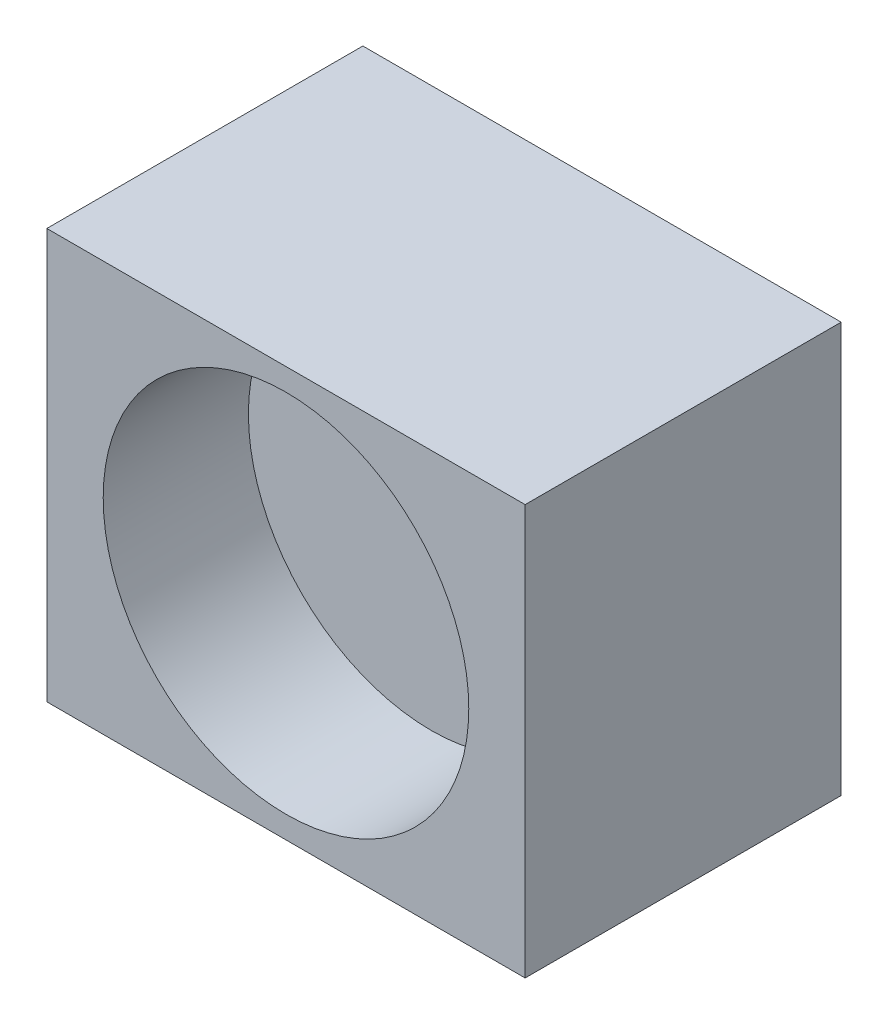
ISO-10303-21;
HEADER;
FILE_DESCRIPTION(('STEP AP214'),'2;1');
FILE_NAME('part.step','',(''),(''),'','','');
FILE_SCHEMA(('AUTOMOTIVE_DESIGN { 1 0 10303 214 1 1 1 1 }'));
ENDSEC;
DATA;
#1=APPLICATION_CONTEXT('core data for automotive mechanical design processes');
#2=APPLICATION_PROTOCOL_DEFINITION('international standard','automotive_design',2000,#1);
#3=PRODUCT_CONTEXT('',#1,'mechanical');
#4=PRODUCT('Part','Part','',(#3));
#5=PRODUCT_RELATED_PRODUCT_CATEGORY('part','',(#4));
#6=PRODUCT_DEFINITION_FORMATION('','',#4);
#7=PRODUCT_DEFINITION_CONTEXT('part definition',#1,'design');
#8=PRODUCT_DEFINITION('design','',#6,#7);
#9=PRODUCT_DEFINITION_SHAPE('','',#8);
#10=(LENGTH_UNIT() NAMED_UNIT(*) SI_UNIT(.MILLI.,.METRE.));
#11=(NAMED_UNIT(*) PLANE_ANGLE_UNIT() SI_UNIT($,.RADIAN.));
#12=(NAMED_UNIT(*) SI_UNIT($,.STERADIAN.) SOLID_ANGLE_UNIT());
#13=UNCERTAINTY_MEASURE_WITH_UNIT(LENGTH_MEASURE(1.E-05),#10,'distance_accuracy_value','');
#14=(GEOMETRIC_REPRESENTATION_CONTEXT(3) GLOBAL_UNCERTAINTY_ASSIGNED_CONTEXT((#13)) GLOBAL_UNIT_ASSIGNED_CONTEXT((#10,
#11,#12)) REPRESENTATION_CONTEXT('',''));
#15=CARTESIAN_POINT('',(0.,0.,0.));
#16=DIRECTION('',(0.,0.,1.));
#17=DIRECTION('',(1.,0.,0.));
#18=AXIS2_PLACEMENT_3D('',#15,#16,#17);
#19=CARTESIAN_POINT('',(28.,24.,37.));
#20=DIRECTION('',(-1.,0.,0.));
#21=DIRECTION('',(0.,-1.,0.));
#22=AXIS2_PLACEMENT_3D('',#19,#20,#21);
#23=PLANE('',#22);
#24=DIRECTION('',(0.,1.,0.));
#25=VECTOR('',#24,1.);
#26=CARTESIAN_POINT('',(28.,24.,0.));
#27=LINE('',#26,#25);
#28=CARTESIAN_POINT('',(28.,-24.,0.));
#29=VERTEX_POINT('',#28);
#30=CARTESIAN_POINT('',(28.,24.,0.));
#31=VERTEX_POINT('',#30);
#32=EDGE_CURVE('E113',#29,#31,#27,.T.);
#33=ORIENTED_EDGE('',*,*,#32,.T.);
#34=DIRECTION('',(0.,0.,-1.));
#35=VECTOR('',#34,1.);
#36=CARTESIAN_POINT('',(28.,24.,37.));
#37=LINE('',#36,#35);
#38=CARTESIAN_POINT('',(28.,24.,37.));
#39=VERTEX_POINT('',#38);
#40=EDGE_CURVE('E11',#39,#31,#37,.T.);
#41=ORIENTED_EDGE('',*,*,#40,.F.);
#42=DIRECTION('',(0.,1.,0.));
#43=VECTOR('',#42,1.);
#44=CARTESIAN_POINT('',(28.,24.,37.));
#45=LINE('',#44,#43);
#46=CARTESIAN_POINT('',(28.,-24.,37.));
#47=VERTEX_POINT('',#46);
#48=EDGE_CURVE('E97',#47,#39,#45,.T.);
#49=ORIENTED_EDGE('',*,*,#48,.F.);
#50=DIRECTION('',(0.,0.,-1.));
#51=VECTOR('',#50,1.);
#52=CARTESIAN_POINT('',(28.,-24.,37.));
#53=LINE('',#52,#51);
#54=EDGE_CURVE('E109',#47,#29,#53,.T.);
#55=ORIENTED_EDGE('',*,*,#54,.T.);
#56=EDGE_LOOP('',(#33,#41,#49,#55));
#57=FACE_BOUND('',#56,.T.);
#58=ADVANCED_FACE('F45',(#57),#23,.F.);
#59=CARTESIAN_POINT('',(-28.,24.,37.));
#60=DIRECTION('',(0.,-1.,0.));
#61=DIRECTION('',(0.,0.,-1.));
#62=AXIS2_PLACEMENT_3D('',#59,#60,#61);
#63=PLANE('',#62);
#64=DIRECTION('',(-1.,0.,0.));
#65=VECTOR('',#64,1.);
#66=CARTESIAN_POINT('',(-28.,24.,0.));
#67=LINE('',#66,#65);
#68=CARTESIAN_POINT('',(-28.,24.,0.));
#69=VERTEX_POINT('',#68);
#70=EDGE_CURVE('E102',#31,#69,#67,.T.);
#71=ORIENTED_EDGE('',*,*,#70,.T.);
#72=DIRECTION('',(0.,0.,-1.));
#73=VECTOR('',#72,1.);
#74=CARTESIAN_POINT('',(-28.,24.,37.));
#75=LINE('',#74,#73);
#76=CARTESIAN_POINT('',(-28.,24.,37.));
#77=VERTEX_POINT('',#76);
#78=EDGE_CURVE('E54',#77,#69,#75,.T.);
#79=ORIENTED_EDGE('',*,*,#78,.F.);
#80=DIRECTION('',(-1.,0.,0.));
#81=VECTOR('',#80,1.);
#82=CARTESIAN_POINT('',(-28.,24.,37.));
#83=LINE('',#82,#81);
#84=EDGE_CURVE('E92',#39,#77,#83,.T.);
#85=ORIENTED_EDGE('',*,*,#84,.F.);
#86=ORIENTED_EDGE('',*,*,#40,.T.);
#87=EDGE_LOOP('',(#71,#79,#85,#86));
#88=FACE_BOUND('',#87,.T.);
#89=ADVANCED_FACE('F101',(#88),#63,.F.);
#90=CARTESIAN_POINT('',(-28.,24.,37.));
#91=DIRECTION('',(1.,0.,0.));
#92=DIRECTION('',(0.,1.,0.));
#93=AXIS2_PLACEMENT_3D('',#90,#91,#92);
#94=PLANE('',#93);
#95=DIRECTION('',(0.,-1.,0.));
#96=VECTOR('',#95,1.);
#97=CARTESIAN_POINT('',(-28.,24.,0.));
#98=LINE('',#97,#96);
#99=CARTESIAN_POINT('',(-28.,-24.,0.));
#100=VERTEX_POINT('',#99);
#101=EDGE_CURVE('E79',#69,#100,#98,.T.);
#102=ORIENTED_EDGE('',*,*,#101,.T.);
#103=DIRECTION('',(0.,0.,-1.));
#104=VECTOR('',#103,1.);
#105=CARTESIAN_POINT('',(-28.,-24.,37.));
#106=LINE('',#105,#104);
#107=CARTESIAN_POINT('',(-28.,-24.,37.));
#108=VERTEX_POINT('',#107);
#109=EDGE_CURVE('E104',#108,#100,#106,.T.);
#110=ORIENTED_EDGE('',*,*,#109,.F.);
#111=DIRECTION('',(0.,-1.,0.));
#112=VECTOR('',#111,1.);
#113=CARTESIAN_POINT('',(-28.,24.,37.));
#114=LINE('',#113,#112);
#115=EDGE_CURVE('E95',#77,#108,#114,.T.);
#116=ORIENTED_EDGE('',*,*,#115,.F.);
#117=ORIENTED_EDGE('',*,*,#78,.T.);
#118=EDGE_LOOP('',(#102,#110,#116,#117));
#119=FACE_BOUND('',#118,.T.);
#120=ADVANCED_FACE('F105',(#119),#94,.F.);
#121=CARTESIAN_POINT('',(-28.,-24.,37.));
#122=DIRECTION('',(0.,1.,0.));
#123=DIRECTION('',(0.,0.,1.));
#124=AXIS2_PLACEMENT_3D('',#121,#122,#123);
#125=PLANE('',#124);
#126=CARTESIAN_POINT('',(24.,-24.,33.5));
#127=DIRECTION('',(0.,-1.,0.));
#128=DIRECTION('',(0.,0.,-1.));
#129=AXIS2_PLACEMENT_3D('',#126,#127,#128);
#130=CIRCLE('',#129,2.5);
#131=CARTESIAN_POINT('',(24.,-24.,31.));
#132=VERTEX_POINT('',#131);
#133=EDGE_CURVE('E154',#132,#132,#130,.T.);
#134=ORIENTED_EDGE('',*,*,#133,.F.);
#135=EDGE_LOOP('',(#134));
#136=FACE_BOUND('',#135,.T.);
#137=CARTESIAN_POINT('',(24.,-24.,3.5));
#138=DIRECTION('',(0.,-1.,0.));
#139=DIRECTION('',(0.,0.,-1.));
#140=AXIS2_PLACEMENT_3D('',#137,#138,#139);
#141=CIRCLE('',#140,2.5);
#142=CARTESIAN_POINT('',(24.,-24.,1.));
#143=VERTEX_POINT('',#142);
#144=EDGE_CURVE('E162',#143,#143,#141,.T.);
#145=ORIENTED_EDGE('',*,*,#144,.F.);
#146=EDGE_LOOP('',(#145));
#147=FACE_BOUND('',#146,.T.);
#148=CARTESIAN_POINT('',(-24.,-24.,3.5));
#149=DIRECTION('',(0.,-1.,0.));
#150=DIRECTION('',(0.,0.,-1.));
#151=AXIS2_PLACEMENT_3D('',#148,#149,#150);
#152=CIRCLE('',#151,2.5);
#153=CARTESIAN_POINT('',(-24.,-24.,1.));
#154=VERTEX_POINT('',#153);
#155=EDGE_CURVE('E146',#154,#154,#152,.T.);
#156=ORIENTED_EDGE('',*,*,#155,.F.);
#157=EDGE_LOOP('',(#156));
#158=FACE_BOUND('',#157,.T.);
#159=CARTESIAN_POINT('',(-24.,-24.,33.5));
#160=DIRECTION('',(0.,-1.,0.));
#161=DIRECTION('',(0.,0.,-1.));
#162=AXIS2_PLACEMENT_3D('',#159,#160,#161);
#163=CIRCLE('',#162,2.5);
#164=CARTESIAN_POINT('',(-24.,-24.,31.));
#165=VERTEX_POINT('',#164);
#166=EDGE_CURVE('E142',#165,#165,#163,.T.);
#167=ORIENTED_EDGE('',*,*,#166,.F.);
#168=EDGE_LOOP('',(#167));
#169=FACE_BOUND('',#168,.T.);
#170=DIRECTION('',(1.,0.,0.));
#171=VECTOR('',#170,1.);
#172=CARTESIAN_POINT('',(-28.,-24.,0.));
#173=LINE('',#172,#171);
#174=EDGE_CURVE('E85',#100,#29,#173,.T.);
#175=ORIENTED_EDGE('',*,*,#174,.T.);
#176=ORIENTED_EDGE('',*,*,#54,.F.);
#177=DIRECTION('',(1.,0.,0.));
#178=VECTOR('',#177,1.);
#179=CARTESIAN_POINT('',(-28.,-24.,37.));
#180=LINE('',#179,#178);
#181=EDGE_CURVE('E62',#108,#47,#180,.T.);
#182=ORIENTED_EDGE('',*,*,#181,.F.);
#183=ORIENTED_EDGE('',*,*,#109,.T.);
#184=EDGE_LOOP('',(#175,#176,#182,#183));
#185=FACE_BOUND('',#184,.T.);
#186=ADVANCED_FACE('F127',(#136,#147,#158,#169,#185),#125,.F.);
#187=CARTESIAN_POINT('',(0.,0.,37.));
#188=DIRECTION('',(0.,0.,1.));
#189=DIRECTION('',(1.,0.,0.));
#190=AXIS2_PLACEMENT_3D('',#187,#188,#189);
#191=PLANE('',#190);
#192=CARTESIAN_POINT('',(0.,0.,37.));
#193=DIRECTION('',(0.,0.,1.));
#194=DIRECTION('',(1.,0.,0.));
#195=AXIS2_PLACEMENT_3D('',#192,#193,#194);
#196=CIRCLE('',#195,21.4);
#197=CARTESIAN_POINT('',(21.4,0.,37.));
#198=VERTEX_POINT('',#197);
#199=EDGE_CURVE('E134',#198,#198,#196,.T.);
#200=ORIENTED_EDGE('',*,*,#199,.F.);
#201=EDGE_LOOP('',(#200));
#202=FACE_BOUND('',#201,.T.);
#203=ORIENTED_EDGE('',*,*,#48,.T.);
#204=ORIENTED_EDGE('',*,*,#84,.T.);
#205=ORIENTED_EDGE('',*,*,#115,.T.);
#206=ORIENTED_EDGE('',*,*,#181,.T.);
#207=EDGE_LOOP('',(#203,#204,#205,#206));
#208=FACE_BOUND('',#207,.T.);
#209=ADVANCED_FACE('F93',(#202,#208),#191,.T.);
#210=CARTESIAN_POINT('',(0.,0.,0.));
#211=DIRECTION('',(0.,0.,1.));
#212=DIRECTION('',(1.,0.,0.));
#213=AXIS2_PLACEMENT_3D('',#210,#211,#212);
#214=PLANE('',#213);
#215=ORIENTED_EDGE('',*,*,#32,.F.);
#216=ORIENTED_EDGE('',*,*,#174,.F.);
#217=ORIENTED_EDGE('',*,*,#101,.F.);
#218=ORIENTED_EDGE('',*,*,#70,.F.);
#219=EDGE_LOOP('',(#215,#216,#217,#218));
#220=FACE_BOUND('',#219,.T.);
#221=ADVANCED_FACE('F130',(#220),#214,.F.);
#222=CARTESIAN_POINT('',(0.,0.,20.));
#223=DIRECTION('',(0.,0.,1.));
#224=DIRECTION('',(1.,0.,0.));
#225=AXIS2_PLACEMENT_3D('',#222,#223,#224);
#226=CYLINDRICAL_SURFACE('',#225,21.4);
#227=CARTESIAN_POINT('',(0.,0.,20.));
#228=DIRECTION('',(0.,0.,1.));
#229=DIRECTION('',(1.,0.,0.));
#230=AXIS2_PLACEMENT_3D('',#227,#228,#229);
#231=CIRCLE('',#230,21.4);
#232=CARTESIAN_POINT('',(21.4,0.,20.));
#233=VERTEX_POINT('',#232);
#234=EDGE_CURVE('E117',#233,#233,#231,.T.);
#235=ORIENTED_EDGE('',*,*,#234,.F.);
#236=EDGE_LOOP('',(#235));
#237=FACE_BOUND('',#236,.T.);
#238=ORIENTED_EDGE('',*,*,#199,.T.);
#239=EDGE_LOOP('',(#238));
#240=FACE_BOUND('',#239,.T.);
#241=ADVANCED_FACE('F194',(#237,#240),#226,.F.);
#242=CARTESIAN_POINT('',(0.,0.,20.));
#243=DIRECTION('',(0.,0.,1.));
#244=DIRECTION('',(1.,0.,0.));
#245=AXIS2_PLACEMENT_3D('',#242,#243,#244);
#246=PLANE('',#245);
#247=ORIENTED_EDGE('',*,*,#234,.T.);
#248=EDGE_LOOP('',(#247));
#249=FACE_BOUND('',#248,.T.);
#250=ADVANCED_FACE('F185',(#249),#246,.T.);
#251=CARTESIAN_POINT('',(-24.,-19.,33.5));
#252=DIRECTION('',(0.,-1.,0.));
#253=DIRECTION('',(0.,0.,-1.));
#254=AXIS2_PLACEMENT_3D('',#251,#252,#253);
#255=CYLINDRICAL_SURFACE('',#254,2.5);
#256=CARTESIAN_POINT('',(-24.,-19.,33.5));
#257=DIRECTION('',(0.,-1.,0.));
#258=DIRECTION('',(0.,0.,-1.));
#259=AXIS2_PLACEMENT_3D('',#256,#257,#258);
#260=CIRCLE('',#259,2.5);
#261=CARTESIAN_POINT('',(-24.,-19.,31.));
#262=VERTEX_POINT('',#261);
#263=EDGE_CURVE('E138',#262,#262,#260,.T.);
#264=ORIENTED_EDGE('',*,*,#263,.F.);
#265=EDGE_LOOP('',(#264));
#266=FACE_BOUND('',#265,.T.);
#267=ORIENTED_EDGE('',*,*,#166,.T.);
#268=EDGE_LOOP('',(#267));
#269=FACE_BOUND('',#268,.T.);
#270=ADVANCED_FACE('F182',(#266,#269),#255,.F.);
#271=CARTESIAN_POINT('',(-24.,-19.,33.5));
#272=DIRECTION('',(0.,-1.,0.));
#273=DIRECTION('',(0.,0.,-1.));
#274=AXIS2_PLACEMENT_3D('',#271,#272,#273);
#275=PLANE('',#274);
#276=ORIENTED_EDGE('',*,*,#263,.T.);
#277=EDGE_LOOP('',(#276));
#278=FACE_BOUND('',#277,.T.);
#279=ADVANCED_FACE('F184',(#278),#275,.T.);
#280=CARTESIAN_POINT('',(-24.,-19.,3.5));
#281=DIRECTION('',(0.,-1.,0.));
#282=DIRECTION('',(0.,0.,-1.));
#283=AXIS2_PLACEMENT_3D('',#280,#281,#282);
#284=CYLINDRICAL_SURFACE('',#283,2.5);
#285=CARTESIAN_POINT('',(-24.,-19.,3.5));
#286=DIRECTION('',(0.,-1.,0.));
#287=DIRECTION('',(0.,0.,-1.));
#288=AXIS2_PLACEMENT_3D('',#285,#286,#287);
#289=CIRCLE('',#288,2.5);
#290=CARTESIAN_POINT('',(-24.,-19.,1.));
#291=VERTEX_POINT('',#290);
#292=EDGE_CURVE('E166',#291,#291,#289,.T.);
#293=ORIENTED_EDGE('',*,*,#292,.F.);
#294=EDGE_LOOP('',(#293));
#295=FACE_BOUND('',#294,.T.);
#296=ORIENTED_EDGE('',*,*,#155,.T.);
#297=EDGE_LOOP('',(#296));
#298=FACE_BOUND('',#297,.T.);
#299=ADVANCED_FACE('F174',(#295,#298),#284,.F.);
#300=CARTESIAN_POINT('',(-24.,-19.,3.5));
#301=DIRECTION('',(0.,-1.,0.));
#302=DIRECTION('',(0.,0.,-1.));
#303=AXIS2_PLACEMENT_3D('',#300,#301,#302);
#304=PLANE('',#303);
#305=ORIENTED_EDGE('',*,*,#292,.T.);
#306=EDGE_LOOP('',(#305));
#307=FACE_BOUND('',#306,.T.);
#308=ADVANCED_FACE('F266',(#307),#304,.T.);
#309=CARTESIAN_POINT('',(24.,-19.,3.5));
#310=DIRECTION('',(0.,-1.,0.));
#311=DIRECTION('',(0.,0.,-1.));
#312=AXIS2_PLACEMENT_3D('',#309,#310,#311);
#313=CYLINDRICAL_SURFACE('',#312,2.5);
#314=CARTESIAN_POINT('',(24.,-19.,3.5));
#315=DIRECTION('',(0.,-1.,0.));
#316=DIRECTION('',(0.,0.,-1.));
#317=AXIS2_PLACEMENT_3D('',#314,#315,#316);
#318=CIRCLE('',#317,2.5);
#319=CARTESIAN_POINT('',(24.,-19.,1.));
#320=VERTEX_POINT('',#319);
#321=EDGE_CURVE('E158',#320,#320,#318,.T.);
#322=ORIENTED_EDGE('',*,*,#321,.F.);
#323=EDGE_LOOP('',(#322));
#324=FACE_BOUND('',#323,.T.);
#325=ORIENTED_EDGE('',*,*,#144,.T.);
#326=EDGE_LOOP('',(#325));
#327=FACE_BOUND('',#326,.T.);
#328=ADVANCED_FACE('F275',(#324,#327),#313,.F.);
#329=CARTESIAN_POINT('',(24.,-19.,3.5));
#330=DIRECTION('',(0.,-1.,0.));
#331=DIRECTION('',(0.,0.,-1.));
#332=AXIS2_PLACEMENT_3D('',#329,#330,#331);
#333=PLANE('',#332);
#334=ORIENTED_EDGE('',*,*,#321,.T.);
#335=EDGE_LOOP('',(#334));
#336=FACE_BOUND('',#335,.T.);
#337=ADVANCED_FACE('F284',(#336),#333,.T.);
#338=CARTESIAN_POINT('',(24.,-19.,33.5));
#339=DIRECTION('',(0.,-1.,0.));
#340=DIRECTION('',(0.,0.,-1.));
#341=AXIS2_PLACEMENT_3D('',#338,#339,#340);
#342=CYLINDRICAL_SURFACE('',#341,2.5);
#343=CARTESIAN_POINT('',(24.,-19.,33.5));
#344=DIRECTION('',(0.,-1.,0.));
#345=DIRECTION('',(0.,0.,-1.));
#346=AXIS2_PLACEMENT_3D('',#343,#344,#345);
#347=CIRCLE('',#346,2.5);
#348=CARTESIAN_POINT('',(24.,-19.,31.));
#349=VERTEX_POINT('',#348);
#350=EDGE_CURVE('E150',#349,#349,#347,.T.);
#351=ORIENTED_EDGE('',*,*,#350,.F.);
#352=EDGE_LOOP('',(#351));
#353=FACE_BOUND('',#352,.T.);
#354=ORIENTED_EDGE('',*,*,#133,.T.);
#355=EDGE_LOOP('',(#354));
#356=FACE_BOUND('',#355,.T.);
#357=ADVANCED_FACE('F293',(#353,#356),#342,.F.);
#358=CARTESIAN_POINT('',(24.,-19.,33.5));
#359=DIRECTION('',(0.,-1.,0.));
#360=DIRECTION('',(0.,0.,-1.));
#361=AXIS2_PLACEMENT_3D('',#358,#359,#360);
#362=PLANE('',#361);
#363=ORIENTED_EDGE('',*,*,#350,.T.);
#364=EDGE_LOOP('',(#363));
#365=FACE_BOUND('',#364,.T.);
#366=ADVANCED_FACE('F302',(#365),#362,.T.);
#367=CLOSED_SHELL('',(#58,#89,#120,#186,#209,#221,#241,#250,#270,#279,#299,#308,#328,#337,#357,#366));
#368=MANIFOLD_SOLID_BREP('B2',#367);
#369=ADVANCED_BREP_SHAPE_REPRESENTATION('',(#18,#368),#14);
#370=SHAPE_DEFINITION_REPRESENTATION(#9,#369);
ENDSEC;
END-ISO-10303-21;
